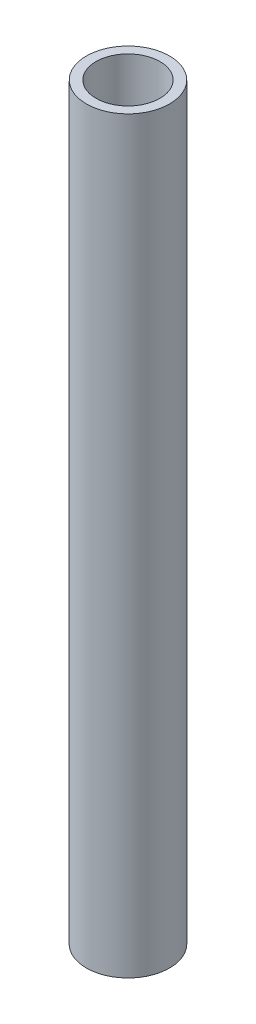
ISO-10303-21;
HEADER;
FILE_DESCRIPTION(('STEP AP214'),'2;1');
FILE_NAME('part.step','',(''),(''),'','','');
FILE_SCHEMA(('AUTOMOTIVE_DESIGN { 1 0 10303 214 1 1 1 1 }'));
ENDSEC;
DATA;
#1=APPLICATION_CONTEXT('core data for automotive mechanical design processes');
#2=APPLICATION_PROTOCOL_DEFINITION('international standard','automotive_design',2000,#1);
#3=PRODUCT_CONTEXT('',#1,'mechanical');
#4=PRODUCT('Part','Part','',(#3));
#5=PRODUCT_RELATED_PRODUCT_CATEGORY('part','',(#4));
#6=PRODUCT_DEFINITION_FORMATION('','',#4);
#7=PRODUCT_DEFINITION_CONTEXT('part definition',#1,'design');
#8=PRODUCT_DEFINITION('design','',#6,#7);
#9=PRODUCT_DEFINITION_SHAPE('','',#8);
#10=(LENGTH_UNIT() NAMED_UNIT(*) SI_UNIT(.MILLI.,.METRE.));
#11=(NAMED_UNIT(*) PLANE_ANGLE_UNIT() SI_UNIT($,.RADIAN.));
#12=(NAMED_UNIT(*) SI_UNIT($,.STERADIAN.) SOLID_ANGLE_UNIT());
#13=UNCERTAINTY_MEASURE_WITH_UNIT(LENGTH_MEASURE(1.E-05),#10,'distance_accuracy_value','');
#14=(GEOMETRIC_REPRESENTATION_CONTEXT(3) GLOBAL_UNCERTAINTY_ASSIGNED_CONTEXT((#13)) GLOBAL_UNIT_ASSIGNED_CONTEXT((#10,
#11,#12)) REPRESENTATION_CONTEXT('',''));
#15=CARTESIAN_POINT('',(0.,0.,0.));
#16=DIRECTION('',(0.,0.,1.));
#17=DIRECTION('',(1.,0.,0.));
#18=AXIS2_PLACEMENT_3D('',#15,#16,#17);
#19=CARTESIAN_POINT('',(0.,114.3,0.));
#20=DIRECTION('',(0.,1.,0.));
#21=DIRECTION('',(0.,0.,1.));
#22=AXIS2_PLACEMENT_3D('',#19,#20,#21);
#23=PLANE('',#22);
#24=CARTESIAN_POINT('',(0.,114.3,0.));
#25=DIRECTION('',(0.,1.,0.));
#26=DIRECTION('',(0.,0.,1.));
#27=AXIS2_PLACEMENT_3D('',#24,#25,#26);
#28=CIRCLE('',#27,6.35);
#29=CARTESIAN_POINT('',(0.,114.3,6.35));
#30=VERTEX_POINT('',#29);
#31=EDGE_CURVE('E10',#30,#30,#28,.T.);
#32=ORIENTED_EDGE('',*,*,#31,.T.);
#33=EDGE_LOOP('',(#32));
#34=FACE_BOUND('',#33,.T.);
#35=CARTESIAN_POINT('',(0.,114.3,0.));
#36=DIRECTION('',(0.,1.,0.));
#37=DIRECTION('',(0.,0.,1.));
#38=AXIS2_PLACEMENT_3D('',#35,#36,#37);
#39=CIRCLE('',#38,4.8768);
#40=CARTESIAN_POINT('',(0.,114.3,4.8768));
#41=VERTEX_POINT('',#40);
#42=EDGE_CURVE('E48',#41,#41,#39,.T.);
#43=ORIENTED_EDGE('',*,*,#42,.F.);
#44=EDGE_LOOP('',(#43));
#45=FACE_BOUND('',#44,.T.);
#46=ADVANCED_FACE('F37',(#34,#45),#23,.T.);
#47=CARTESIAN_POINT('',(0.,0.,0.));
#48=DIRECTION('',(0.,1.,0.));
#49=DIRECTION('',(0.,0.,1.));
#50=AXIS2_PLACEMENT_3D('',#47,#48,#49);
#51=PLANE('',#50);
#52=CARTESIAN_POINT('',(0.,0.,0.));
#53=DIRECTION('',(0.,1.,0.));
#54=DIRECTION('',(0.,0.,1.));
#55=AXIS2_PLACEMENT_3D('',#52,#53,#54);
#56=CIRCLE('',#55,6.35);
#57=CARTESIAN_POINT('',(0.,0.,6.35));
#58=VERTEX_POINT('',#57);
#59=EDGE_CURVE('E41',#58,#58,#56,.T.);
#60=ORIENTED_EDGE('',*,*,#59,.F.);
#61=EDGE_LOOP('',(#60));
#62=FACE_BOUND('',#61,.T.);
#63=CARTESIAN_POINT('',(0.,0.,0.));
#64=DIRECTION('',(0.,1.,0.));
#65=DIRECTION('',(0.,0.,1.));
#66=AXIS2_PLACEMENT_3D('',#63,#64,#65);
#67=CIRCLE('',#66,4.8768);
#68=CARTESIAN_POINT('',(0.,0.,4.8768));
#69=VERTEX_POINT('',#68);
#70=EDGE_CURVE('E50',#69,#69,#67,.T.);
#71=ORIENTED_EDGE('',*,*,#70,.T.);
#72=EDGE_LOOP('',(#71));
#73=FACE_BOUND('',#72,.T.);
#74=ADVANCED_FACE('F60',(#62,#73),#51,.F.);
#75=CARTESIAN_POINT('',(0.,114.3,0.));
#76=DIRECTION('',(0.,-1.,0.));
#77=DIRECTION('',(0.,0.,-1.));
#78=AXIS2_PLACEMENT_3D('',#75,#76,#77);
#79=CYLINDRICAL_SURFACE('',#78,6.35);
#80=ORIENTED_EDGE('',*,*,#31,.F.);
#81=EDGE_LOOP('',(#80));
#82=FACE_BOUND('',#81,.T.);
#83=ORIENTED_EDGE('',*,*,#59,.T.);
#84=EDGE_LOOP('',(#83));
#85=FACE_BOUND('',#84,.T.);
#86=ADVANCED_FACE('F39',(#82,#85),#79,.T.);
#87=CARTESIAN_POINT('',(0.,114.3,0.));
#88=DIRECTION('',(0.,-1.,0.));
#89=DIRECTION('',(0.,0.,-1.));
#90=AXIS2_PLACEMENT_3D('',#87,#88,#89);
#91=CYLINDRICAL_SURFACE('',#90,4.8768);
#92=ORIENTED_EDGE('',*,*,#42,.T.);
#93=EDGE_LOOP('',(#92));
#94=FACE_BOUND('',#93,.T.);
#95=ORIENTED_EDGE('',*,*,#70,.F.);
#96=EDGE_LOOP('',(#95));
#97=FACE_BOUND('',#96,.T.);
#98=ADVANCED_FACE('F56',(#94,#97),#91,.F.);
#99=CLOSED_SHELL('',(#46,#74,#86,#98));
#100=MANIFOLD_SOLID_BREP('B2',#99);
#101=ADVANCED_BREP_SHAPE_REPRESENTATION('',(#18,#100),#14);
#102=SHAPE_DEFINITION_REPRESENTATION(#9,#101);
ENDSEC;
END-ISO-10303-21;
